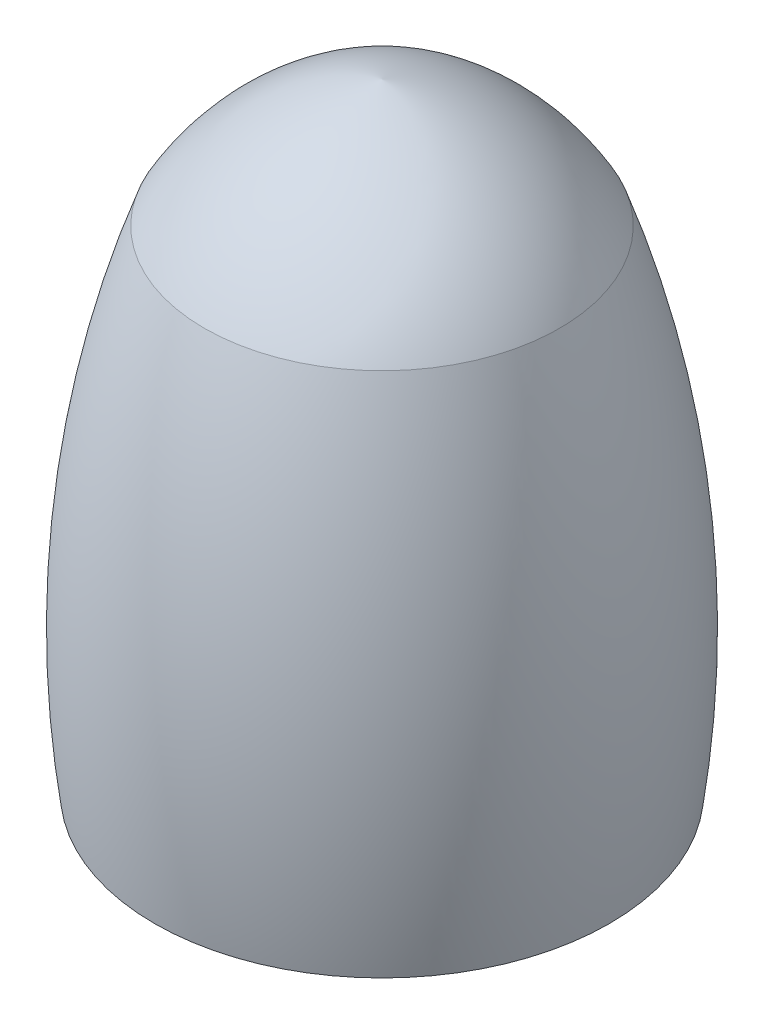
ISO-10303-21;
HEADER;
FILE_DESCRIPTION(('STEP AP214'),'2;1');
FILE_NAME('part.step','',(''),(''),'','','');
FILE_SCHEMA(('AUTOMOTIVE_DESIGN { 1 0 10303 214 1 1 1 1 }'));
ENDSEC;
DATA;
#1=APPLICATION_CONTEXT('core data for automotive mechanical design processes');
#2=APPLICATION_PROTOCOL_DEFINITION('international standard','automotive_design',2000,#1);
#3=PRODUCT_CONTEXT('',#1,'mechanical');
#4=PRODUCT('Part','Part','',(#3));
#5=PRODUCT_RELATED_PRODUCT_CATEGORY('part','',(#4));
#6=PRODUCT_DEFINITION_FORMATION('','',#4);
#7=PRODUCT_DEFINITION_CONTEXT('part definition',#1,'design');
#8=PRODUCT_DEFINITION('design','',#6,#7);
#9=PRODUCT_DEFINITION_SHAPE('','',#8);
#10=(LENGTH_UNIT() NAMED_UNIT(*) SI_UNIT(.MILLI.,.METRE.));
#11=(NAMED_UNIT(*) PLANE_ANGLE_UNIT() SI_UNIT($,.RADIAN.));
#12=(NAMED_UNIT(*) SI_UNIT($,.STERADIAN.) SOLID_ANGLE_UNIT());
#13=UNCERTAINTY_MEASURE_WITH_UNIT(LENGTH_MEASURE(1.E-05),#10,'distance_accuracy_value','');
#14=(GEOMETRIC_REPRESENTATION_CONTEXT(3) GLOBAL_UNCERTAINTY_ASSIGNED_CONTEXT((#13)) GLOBAL_UNIT_ASSIGNED_CONTEXT((#10,
#11,#12)) REPRESENTATION_CONTEXT('',''));
#15=CARTESIAN_POINT('',(0.,0.,0.));
#16=DIRECTION('',(0.,0.,1.));
#17=DIRECTION('',(1.,0.,0.));
#18=AXIS2_PLACEMENT_3D('',#15,#16,#17);
#19=CARTESIAN_POINT('',(0.,0.,0.));
#20=DIRECTION('',(0.,1.,0.));
#21=DIRECTION('',(0.,0.,1.));
#22=AXIS2_PLACEMENT_3D('',#19,#20,#21);
#23=PLANE('',#22);
#24=CARTESIAN_POINT('',(0.,0.,0.));
#25=DIRECTION('',(0.,1.,0.));
#26=DIRECTION('',(0.,0.,1.));
#27=AXIS2_PLACEMENT_3D('',#24,#25,#26);
#28=CIRCLE('',#27,0.820348404117741);
#29=CARTESIAN_POINT('',(0.,0.,0.820348404117741));
#30=VERTEX_POINT('',#29);
#31=EDGE_CURVE('E11',#30,#30,#28,.T.);
#32=ORIENTED_EDGE('',*,*,#31,.F.);
#33=EDGE_LOOP('',(#32));
#34=FACE_BOUND('',#33,.T.);
#35=ADVANCED_FACE('F33',(#34),#23,.F.);
#36=CARTESIAN_POINT('',(0.,0.,0.));
#37=DIRECTION('',(0.,-1.,0.));
#38=DIRECTION('',(0.,0.,-1.));
#39=AXIS2_PLACEMENT_3D('',#36,#37,#38);
#40=CONICAL_SURFACE('',#39,0.820348404117741,0.701214046932986);
#41=CARTESIAN_POINT('',(0.,-0.54497722885693,0.));
#42=DIRECTION('',(0.,1.,0.));
#43=DIRECTION('',(0.,0.,1.));
#44=AXIS2_PLACEMENT_3D('',#41,#42,#43);
#45=CIRCLE('',#44,1.2805085695795);
#46=CARTESIAN_POINT('',(0.,-0.54497722885693,1.2805085695795));
#47=VERTEX_POINT('',#46);
#48=EDGE_CURVE('E39',#47,#47,#45,.T.);
#49=ORIENTED_EDGE('',*,*,#48,.F.);
#50=EDGE_LOOP('',(#49));
#51=FACE_BOUND('',#50,.T.);
#52=ORIENTED_EDGE('',*,*,#31,.T.);
#53=EDGE_LOOP('',(#52));
#54=FACE_BOUND('',#53,.T.);
#55=ADVANCED_FACE('F60',(#51,#54),#40,.F.);
#56=CARTESIAN_POINT('',(0.,-0.544977228856931,-1.2805085695795));
#57=DIRECTION('',(0.,1.,0.));
#58=DIRECTION('',(0.,0.,1.));
#59=AXIS2_PLACEMENT_3D('',#56,#57,#58);
#60=PLANE('',#59);
#61=CARTESIAN_POINT('',(0.,-0.544977228856931,0.));
#62=DIRECTION('',(0.,1.,0.));
#63=DIRECTION('',(0.,0.,1.));
#64=AXIS2_PLACEMENT_3D('',#61,#62,#63);
#65=CIRCLE('',#64,2.7805085695795);
#66=CARTESIAN_POINT('',(0.,-0.544977228856932,2.7805085695795));
#67=VERTEX_POINT('',#66);
#68=EDGE_CURVE('E51',#67,#67,#65,.T.);
#69=ORIENTED_EDGE('',*,*,#68,.F.);
#70=EDGE_LOOP('',(#69));
#71=FACE_BOUND('',#70,.T.);
#72=ORIENTED_EDGE('',*,*,#48,.T.);
#73=EDGE_LOOP('',(#72));
#74=FACE_BOUND('',#73,.T.);
#75=ADVANCED_FACE('F58',(#71,#74),#60,.F.);
#76=CARTESIAN_POINT('',(0.,1.1989808374891,0.));
#77=DIRECTION('',(0.,1.,0.));
#78=DIRECTION('',(0.,0.,1.));
#79=AXIS2_PLACEMENT_3D('',#76,#77,#78);
#80=DEGENERATE_TOROIDAL_SURFACE('',#79,9.88613842165979,12.7861384216598,.F.);
#81=CARTESIAN_POINT('',(0.,5.45249442657344,0.));
#82=DIRECTION('',(0.,1.,0.));
#83=DIRECTION('',(0.,0.,1.));
#84=AXIS2_PLACEMENT_3D('',#81,#82,#83);
#85=CIRCLE('',#84,2.17176180538304);
#86=CARTESIAN_POINT('',(0.,5.45249442657344,2.17176180538304));
#87=VERTEX_POINT('',#86);
#88=EDGE_CURVE('E49',#87,#87,#85,.T.);
#89=ORIENTED_EDGE('',*,*,#88,.F.);
#90=EDGE_LOOP('',(#89));
#91=FACE_BOUND('',#90,.T.);
#92=ORIENTED_EDGE('',*,*,#68,.T.);
#93=EDGE_LOOP('',(#92));
#94=FACE_BOUND('',#93,.T.);
#95=ADVANCED_FACE('F45',(#91,#94),#80,.F.);
#96=CARTESIAN_POINT('',(0.,3.88913474264805,-0.579446558668901));
#97=DIRECTION('',(-1.,0.,0.));
#98=DIRECTION('',(0.,0.,1.));
#99=AXIS2_PLACEMENT_3D('',#96,#97,#98);
#100=CIRCLE('',#99,3.16437054779504);
#101=TRIMMED_CURVE('',#100,(PARAMETER_VALUE(-1.38664131407496)),
(PARAMETER_VALUE(1.38664131407496)),.T.,.PARAMETER.);
#102=CARTESIAN_POINT('',(0.,3.88913474264805,0.));
#103=DIRECTION('',(0.,1.,0.));
#104=AXIS1_PLACEMENT('',#102,#103);
#105=SURFACE_OF_REVOLUTION('',#101,#104);
#106=CARTESIAN_POINT('',(0.,7.,0.));
#107=VERTEX_POINT('',#106);
#108=VERTEX_LOOP('',#107);
#109=FACE_BOUND('',#108,.T.);
#110=ORIENTED_EDGE('',*,*,#88,.T.);
#111=EDGE_LOOP('',(#110));
#112=FACE_BOUND('',#111,.T.);
#113=ADVANCED_FACE('F42',(#109,#112),#105,.T.);
#114=CLOSED_SHELL('',(#35,#55,#75,#95,#113));
#115=MANIFOLD_SOLID_BREP('B2',#114);
#116=ADVANCED_BREP_SHAPE_REPRESENTATION('',(#18,#115),#14);
#117=SHAPE_DEFINITION_REPRESENTATION(#9,#116);
ENDSEC;
END-ISO-10303-21;
